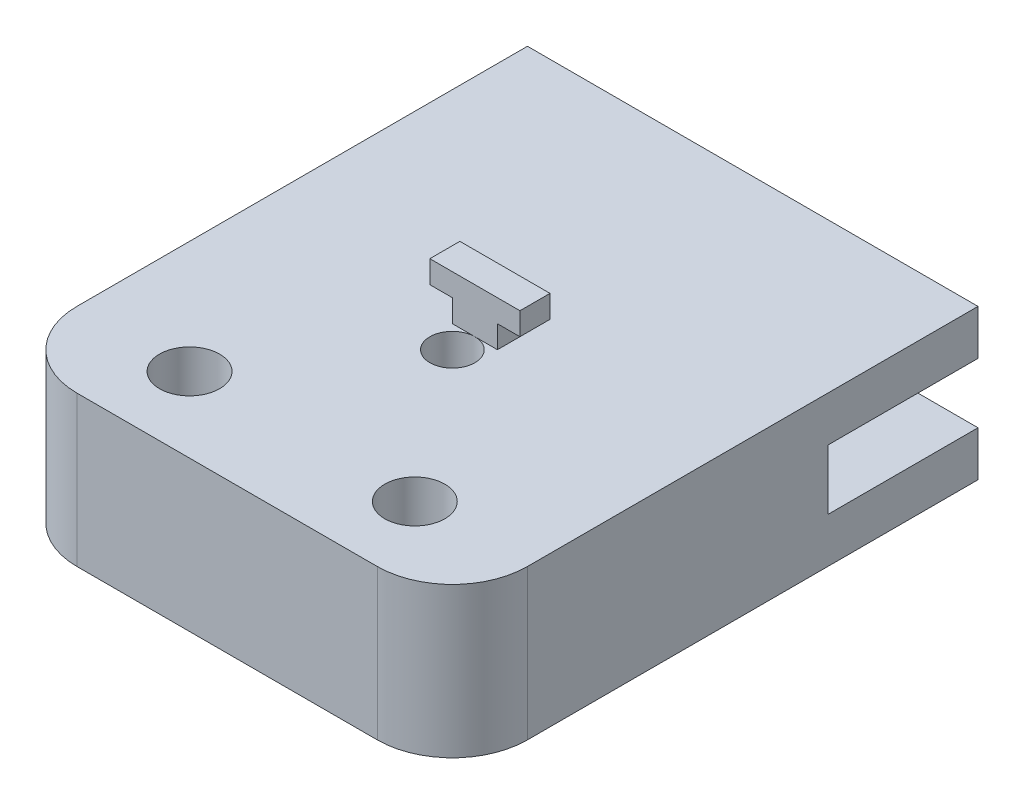
ISO-10303-21;
HEADER;
FILE_DESCRIPTION(('STEP AP214'),'2;1');
FILE_NAME('part.step','',(''),(''),'','','');
FILE_SCHEMA(('AUTOMOTIVE_DESIGN { 1 0 10303 214 1 1 1 1 }'));
ENDSEC;
DATA;
#1=APPLICATION_CONTEXT('core data for automotive mechanical design processes');
#2=APPLICATION_PROTOCOL_DEFINITION('international standard','automotive_design',2000,#1);
#3=PRODUCT_CONTEXT('',#1,'mechanical');
#4=PRODUCT('Part','Part','',(#3));
#5=PRODUCT_RELATED_PRODUCT_CATEGORY('part','',(#4));
#6=PRODUCT_DEFINITION_FORMATION('','',#4);
#7=PRODUCT_DEFINITION_CONTEXT('part definition',#1,'design');
#8=PRODUCT_DEFINITION('design','',#6,#7);
#9=PRODUCT_DEFINITION_SHAPE('','',#8);
#10=(LENGTH_UNIT() NAMED_UNIT(*) SI_UNIT(.MILLI.,.METRE.));
#11=(NAMED_UNIT(*) PLANE_ANGLE_UNIT() SI_UNIT($,.RADIAN.));
#12=(NAMED_UNIT(*) SI_UNIT($,.STERADIAN.) SOLID_ANGLE_UNIT());
#13=UNCERTAINTY_MEASURE_WITH_UNIT(LENGTH_MEASURE(1.E-05),#10,'distance_accuracy_value','');
#14=(GEOMETRIC_REPRESENTATION_CONTEXT(3) GLOBAL_UNCERTAINTY_ASSIGNED_CONTEXT((#13)) GLOBAL_UNIT_ASSIGNED_CONTEXT((#10,
#11,#12)) REPRESENTATION_CONTEXT('',''));
#15=CARTESIAN_POINT('',(0.,0.,0.));
#16=DIRECTION('',(0.,0.,1.));
#17=DIRECTION('',(1.,0.,0.));
#18=AXIS2_PLACEMENT_3D('',#15,#16,#17);
#19=CARTESIAN_POINT('',(0.,10.,0.));
#20=DIRECTION('',(0.,-1.,0.));
#21=DIRECTION('',(0.,0.,-1.));
#22=AXIS2_PLACEMENT_3D('',#19,#20,#21);
#23=PLANE('',#22);
#24=DIRECTION('',(-1.,0.,0.));
#25=VECTOR('',#24,1.);
#26=CARTESIAN_POINT('',(12.,10.,-18.5));
#27=LINE('',#26,#25);
#28=CARTESIAN_POINT('',(16.5,10.,-18.5));
#29=VERTEX_POINT('',#28);
#30=CARTESIAN_POINT('',(13.5,10.,-18.5));
#31=VERTEX_POINT('',#30);
#32=EDGE_CURVE('E307',#29,#31,#27,.T.);
#33=ORIENTED_EDGE('',*,*,#32,.F.);
#34=DIRECTION('',(0.,0.,1.));
#35=VECTOR('',#34,1.);
#36=CARTESIAN_POINT('',(16.5,10.,-19.5));
#37=LINE('',#36,#35);
#38=CARTESIAN_POINT('',(16.5,10.,-16.5));
#39=VERTEX_POINT('',#38);
#40=EDGE_CURVE('E308',#29,#39,#37,.T.);
#41=ORIENTED_EDGE('',*,*,#40,.T.);
#42=DIRECTION('',(1.,0.,0.));
#43=VECTOR('',#42,1.);
#44=CARTESIAN_POINT('',(12.,10.,-16.5));
#45=LINE('',#44,#43);
#46=CARTESIAN_POINT('',(15.,10.,-16.5));
#47=VERTEX_POINT('',#46);
#48=EDGE_CURVE('E284',#47,#39,#45,.T.);
#49=ORIENTED_EDGE('',*,*,#48,.F.);
#50=CARTESIAN_POINT('',(15.,10.,-15.));
#51=DIRECTION('',(0.,1.,0.));
#52=DIRECTION('',(0.,0.,1.));
#53=AXIS2_PLACEMENT_3D('',#50,#51,#52);
#54=CIRCLE('',#53,1.5);
#55=EDGE_CURVE('E187',#47,#47,#54,.T.);
#56=ORIENTED_EDGE('',*,*,#55,.F.);
#57=CARTESIAN_POINT('',(13.5,10.,-16.5));
#58=VERTEX_POINT('',#57);
#59=EDGE_CURVE('E305',#58,#47,#45,.T.);
#60=ORIENTED_EDGE('',*,*,#59,.F.);
#61=DIRECTION('',(0.,0.,1.));
#62=VECTOR('',#61,1.);
#63=CARTESIAN_POINT('',(13.5,10.,-19.5));
#64=LINE('',#63,#62);
#65=EDGE_CURVE('E56',#31,#58,#64,.T.);
#66=ORIENTED_EDGE('',*,*,#65,.F.);
#67=EDGE_LOOP('',(#33,#41,#49,#56,#60,#66));
#68=FACE_BOUND('',#67,.T.);
#69=CARTESIAN_POINT('',(22.5,10.,-5.));
#70=DIRECTION('',(0.,1.,0.));
#71=DIRECTION('',(0.,0.,1.));
#72=AXIS2_PLACEMENT_3D('',#69,#70,#71);
#73=CIRCLE('',#72,2.);
#74=CARTESIAN_POINT('',(22.5,10.,-3.));
#75=VERTEX_POINT('',#74);
#76=EDGE_CURVE('E220',#75,#75,#73,.T.);
#77=ORIENTED_EDGE('',*,*,#76,.F.);
#78=EDGE_LOOP('',(#77));
#79=FACE_BOUND('',#78,.T.);
#80=CARTESIAN_POINT('',(7.5,10.,-5.));
#81=DIRECTION('',(0.,1.,0.));
#82=DIRECTION('',(0.,0.,1.));
#83=AXIS2_PLACEMENT_3D('',#80,#81,#82);
#84=CIRCLE('',#83,2.);
#85=CARTESIAN_POINT('',(7.5,10.,-3.));
#86=VERTEX_POINT('',#85);
#87=EDGE_CURVE('E226',#86,#86,#84,.T.);
#88=ORIENTED_EDGE('',*,*,#87,.F.);
#89=EDGE_LOOP('',(#88));
#90=FACE_BOUND('',#89,.T.);
#91=DIRECTION('',(1.,0.,0.));
#92=VECTOR('',#91,1.);
#93=CARTESIAN_POINT('',(0.,10.,0.));
#94=LINE('',#93,#92);
#95=CARTESIAN_POINT('',(5.,10.,0.));
#96=VERTEX_POINT('',#95);
#97=CARTESIAN_POINT('',(25.,10.,0.));
#98=VERTEX_POINT('',#97);
#99=EDGE_CURVE('E235',#96,#98,#94,.T.);
#100=ORIENTED_EDGE('',*,*,#99,.T.);
#101=CARTESIAN_POINT('',(25.,10.,-5.));
#102=DIRECTION('',(0.,-1.,0.));
#103=DIRECTION('',(0.,0.,-1.));
#104=AXIS2_PLACEMENT_3D('',#101,#102,#103);
#105=CIRCLE('',#104,5.);
#106=CARTESIAN_POINT('',(30.,10.,-5.));
#107=VERTEX_POINT('',#106);
#108=EDGE_CURVE('E280',#98,#107,#105,.F.);
#109=ORIENTED_EDGE('',*,*,#108,.T.);
#110=DIRECTION('',(0.,0.,-1.));
#111=VECTOR('',#110,1.);
#112=CARTESIAN_POINT('',(30.,10.,0.));
#113=LINE('',#112,#111);
#114=CARTESIAN_POINT('',(30.,10.,-35.));
#115=VERTEX_POINT('',#114);
#116=EDGE_CURVE('E239',#107,#115,#113,.T.);
#117=ORIENTED_EDGE('',*,*,#116,.T.);
#118=DIRECTION('',(-1.,0.,0.));
#119=VECTOR('',#118,1.);
#120=CARTESIAN_POINT('',(0.,10.,-35.));
#121=LINE('',#120,#119);
#122=CARTESIAN_POINT('',(0.,10.,-35.));
#123=VERTEX_POINT('',#122);
#124=EDGE_CURVE('E241',#115,#123,#121,.T.);
#125=ORIENTED_EDGE('',*,*,#124,.T.);
#126=DIRECTION('',(0.,0.,1.));
#127=VECTOR('',#126,1.);
#128=CARTESIAN_POINT('',(0.,10.,0.));
#129=LINE('',#128,#127);
#130=CARTESIAN_POINT('',(0.,10.,-5.));
#131=VERTEX_POINT('',#130);
#132=EDGE_CURVE('E232',#123,#131,#129,.T.);
#133=ORIENTED_EDGE('',*,*,#132,.T.);
#134=CARTESIAN_POINT('',(5.,10.,-5.));
#135=DIRECTION('',(0.,-1.,0.));
#136=DIRECTION('',(0.,0.,-1.));
#137=AXIS2_PLACEMENT_3D('',#134,#135,#136);
#138=CIRCLE('',#137,5.);
#139=EDGE_CURVE('E278',#131,#96,#138,.F.);
#140=ORIENTED_EDGE('',*,*,#139,.T.);
#141=EDGE_LOOP('',(#100,#109,#117,#125,#133,#140));
#142=FACE_BOUND('',#141,.T.);
#143=ADVANCED_FACE('F33',(#68,#79,#90,#142),#23,.F.);
#144=CARTESIAN_POINT('',(0.,10.,-35.));
#145=DIRECTION('',(0.,0.,1.));
#146=DIRECTION('',(1.,0.,0.));
#147=AXIS2_PLACEMENT_3D('',#144,#145,#146);
#148=PLANE('',#147);
#149=DIRECTION('',(0.,-1.,0.));
#150=VECTOR('',#149,1.);
#151=CARTESIAN_POINT('',(0.,10.,-35.));
#152=LINE('',#151,#150);
#153=CARTESIAN_POINT('',(0.,3.,-35.));
#154=VERTEX_POINT('',#153);
#155=CARTESIAN_POINT('',(0.,0.,-35.));
#156=VERTEX_POINT('',#155);
#157=EDGE_CURVE('E243',#154,#156,#152,.T.);
#158=ORIENTED_EDGE('',*,*,#157,.F.);
#159=DIRECTION('',(1.,0.,0.));
#160=VECTOR('',#159,1.);
#161=CARTESIAN_POINT('',(0.,3.,-35.));
#162=LINE('',#161,#160);
#163=CARTESIAN_POINT('',(30.,3.,-35.));
#164=VERTEX_POINT('',#163);
#165=EDGE_CURVE('E263',#154,#164,#162,.T.);
#166=ORIENTED_EDGE('',*,*,#165,.T.);
#167=DIRECTION('',(0.,-1.,0.));
#168=VECTOR('',#167,1.);
#169=CARTESIAN_POINT('',(30.,10.,-35.));
#170=LINE('',#169,#168);
#171=CARTESIAN_POINT('',(30.,0.,-35.));
#172=VERTEX_POINT('',#171);
#173=EDGE_CURVE('E256',#164,#172,#170,.T.);
#174=ORIENTED_EDGE('',*,*,#173,.T.);
#175=DIRECTION('',(-1.,0.,0.));
#176=VECTOR('',#175,1.);
#177=CARTESIAN_POINT('',(0.,0.,-35.));
#178=LINE('',#177,#176);
#179=EDGE_CURVE('E236',#172,#156,#178,.T.);
#180=ORIENTED_EDGE('',*,*,#179,.T.);
#181=EDGE_LOOP('',(#158,#166,#174,#180));
#182=FACE_BOUND('',#181,.T.);
#183=ADVANCED_FACE('F348',(#182),#148,.F.);
#184=CARTESIAN_POINT('',(0.,0.,0.));
#185=DIRECTION('',(0.,-1.,0.));
#186=DIRECTION('',(0.,0.,-1.));
#187=AXIS2_PLACEMENT_3D('',#184,#185,#186);
#188=PLANE('',#187);
#189=CARTESIAN_POINT('',(15.,0.,-15.));
#190=DIRECTION('',(0.,1.,0.));
#191=DIRECTION('',(0.,0.,1.));
#192=AXIS2_PLACEMENT_3D('',#189,#190,#191);
#193=CIRCLE('',#192,1.5);
#194=CARTESIAN_POINT('',(15.,0.,-13.5));
#195=VERTEX_POINT('',#194);
#196=EDGE_CURVE('E193',#195,#195,#193,.T.);
#197=ORIENTED_EDGE('',*,*,#196,.T.);
#198=EDGE_LOOP('',(#197));
#199=FACE_BOUND('',#198,.T.);
#200=CARTESIAN_POINT('',(7.5,0.,-5.));
#201=DIRECTION('',(0.,1.,0.));
#202=DIRECTION('',(0.,0.,1.));
#203=AXIS2_PLACEMENT_3D('',#200,#201,#202);
#204=CIRCLE('',#203,2.);
#205=CARTESIAN_POINT('',(7.5,0.,-3.));
#206=VERTEX_POINT('',#205);
#207=EDGE_CURVE('E223',#206,#206,#204,.T.);
#208=ORIENTED_EDGE('',*,*,#207,.T.);
#209=EDGE_LOOP('',(#208));
#210=FACE_BOUND('',#209,.T.);
#211=DIRECTION('',(0.,0.,-1.));
#212=VECTOR('',#211,1.);
#213=CARTESIAN_POINT('',(30.,0.,0.));
#214=LINE('',#213,#212);
#215=CARTESIAN_POINT('',(30.,0.,-5.));
#216=VERTEX_POINT('',#215);
#217=EDGE_CURVE('E249',#216,#172,#214,.T.);
#218=ORIENTED_EDGE('',*,*,#217,.F.);
#219=CARTESIAN_POINT('',(25.,0.,-5.));
#220=DIRECTION('',(0.,-1.,0.));
#221=DIRECTION('',(0.,0.,-1.));
#222=AXIS2_PLACEMENT_3D('',#219,#220,#221);
#223=CIRCLE('',#222,5.);
#224=CARTESIAN_POINT('',(25.,0.,0.));
#225=VERTEX_POINT('',#224);
#226=EDGE_CURVE('E271',#216,#225,#223,.T.);
#227=ORIENTED_EDGE('',*,*,#226,.T.);
#228=DIRECTION('',(1.,0.,0.));
#229=VECTOR('',#228,1.);
#230=CARTESIAN_POINT('',(0.,0.,0.));
#231=LINE('',#230,#229);
#232=CARTESIAN_POINT('',(5.,0.,0.));
#233=VERTEX_POINT('',#232);
#234=EDGE_CURVE('E246',#233,#225,#231,.T.);
#235=ORIENTED_EDGE('',*,*,#234,.F.);
#236=CARTESIAN_POINT('',(5.,0.,-5.));
#237=DIRECTION('',(0.,-1.,0.));
#238=DIRECTION('',(0.,0.,-1.));
#239=AXIS2_PLACEMENT_3D('',#236,#237,#238);
#240=CIRCLE('',#239,5.);
#241=CARTESIAN_POINT('',(0.,0.,-5.));
#242=VERTEX_POINT('',#241);
#243=EDGE_CURVE('E269',#233,#242,#240,.T.);
#244=ORIENTED_EDGE('',*,*,#243,.T.);
#245=DIRECTION('',(0.,0.,1.));
#246=VECTOR('',#245,1.);
#247=CARTESIAN_POINT('',(0.,0.,0.));
#248=LINE('',#247,#246);
#249=EDGE_CURVE('E229',#156,#242,#248,.T.);
#250=ORIENTED_EDGE('',*,*,#249,.F.);
#251=ORIENTED_EDGE('',*,*,#179,.F.);
#252=EDGE_LOOP('',(#218,#227,#235,#244,#250,#251));
#253=FACE_BOUND('',#252,.T.);
#254=CARTESIAN_POINT('',(22.5,0.,-5.));
#255=DIRECTION('',(0.,1.,0.));
#256=DIRECTION('',(0.,0.,1.));
#257=AXIS2_PLACEMENT_3D('',#254,#255,#256);
#258=CIRCLE('',#257,2.);
#259=CARTESIAN_POINT('',(22.5,0.,-3.));
#260=VERTEX_POINT('',#259);
#261=EDGE_CURVE('E219',#260,#260,#258,.T.);
#262=ORIENTED_EDGE('',*,*,#261,.T.);
#263=EDGE_LOOP('',(#262));
#264=FACE_BOUND('',#263,.T.);
#265=ADVANCED_FACE('F353',(#199,#210,#253,#264),#188,.T.);
#266=CARTESIAN_POINT('',(0.,10.,0.));
#267=DIRECTION('',(1.,0.,0.));
#268=DIRECTION('',(0.,0.,-1.));
#269=AXIS2_PLACEMENT_3D('',#266,#267,#268);
#270=PLANE('',#269);
#271=ORIENTED_EDGE('',*,*,#249,.T.);
#272=DIRECTION('',(0.,-1.,0.));
#273=VECTOR('',#272,1.);
#274=CARTESIAN_POINT('',(0.,10.,-5.));
#275=LINE('',#274,#273);
#276=EDGE_CURVE('E282',#242,#131,#275,.F.);
#277=ORIENTED_EDGE('',*,*,#276,.T.);
#278=ORIENTED_EDGE('',*,*,#132,.F.);
#279=CARTESIAN_POINT('',(0.,7.,-35.));
#280=VERTEX_POINT('',#279);
#281=EDGE_CURVE('E253',#123,#280,#152,.T.);
#282=ORIENTED_EDGE('',*,*,#281,.T.);
#283=DIRECTION('',(0.,0.,1.));
#284=VECTOR('',#283,1.);
#285=CARTESIAN_POINT('',(0.,7.,0.));
#286=LINE('',#285,#284);
#287=CARTESIAN_POINT('',(0.,7.,-25.));
#288=VERTEX_POINT('',#287);
#289=EDGE_CURVE('E209',#280,#288,#286,.T.);
#290=ORIENTED_EDGE('',*,*,#289,.T.);
#291=DIRECTION('',(0.,-1.,0.));
#292=VECTOR('',#291,1.);
#293=CARTESIAN_POINT('',(0.,10.,-25.));
#294=LINE('',#293,#292);
#295=CARTESIAN_POINT('',(0.,3.,-25.));
#296=VERTEX_POINT('',#295);
#297=EDGE_CURVE('E216',#288,#296,#294,.T.);
#298=ORIENTED_EDGE('',*,*,#297,.T.);
#299=DIRECTION('',(0.,0.,-1.));
#300=VECTOR('',#299,1.);
#301=CARTESIAN_POINT('',(0.,3.,0.));
#302=LINE('',#301,#300);
#303=EDGE_CURVE('E213',#296,#154,#302,.T.);
#304=ORIENTED_EDGE('',*,*,#303,.T.);
#305=ORIENTED_EDGE('',*,*,#157,.T.);
#306=EDGE_LOOP('',(#271,#277,#278,#282,#290,#298,#304,#305));
#307=FACE_BOUND('',#306,.T.);
#308=ADVANCED_FACE('F362',(#307),#270,.F.);
#309=CARTESIAN_POINT('',(0.,10.,0.));
#310=DIRECTION('',(0.,0.,-1.));
#311=DIRECTION('',(-1.,0.,0.));
#312=AXIS2_PLACEMENT_3D('',#309,#310,#311);
#313=PLANE('',#312);
#314=ORIENTED_EDGE('',*,*,#234,.T.);
#315=DIRECTION('',(0.,-1.,0.));
#316=VECTOR('',#315,1.);
#317=CARTESIAN_POINT('',(25.,10.,0.));
#318=LINE('',#317,#316);
#319=EDGE_CURVE('E276',#225,#98,#318,.F.);
#320=ORIENTED_EDGE('',*,*,#319,.T.);
#321=ORIENTED_EDGE('',*,*,#99,.F.);
#322=DIRECTION('',(0.,-1.,0.));
#323=VECTOR('',#322,1.);
#324=CARTESIAN_POINT('',(5.,10.,0.));
#325=LINE('',#324,#323);
#326=EDGE_CURVE('E273',#96,#233,#325,.T.);
#327=ORIENTED_EDGE('',*,*,#326,.T.);
#328=EDGE_LOOP('',(#314,#320,#321,#327));
#329=FACE_BOUND('',#328,.T.);
#330=ADVANCED_FACE('F370',(#329),#313,.F.);
#331=CARTESIAN_POINT('',(30.,10.,0.));
#332=DIRECTION('',(-1.,0.,0.));
#333=DIRECTION('',(0.,0.,1.));
#334=AXIS2_PLACEMENT_3D('',#331,#332,#333);
#335=PLANE('',#334);
#336=ORIENTED_EDGE('',*,*,#116,.F.);
#337=DIRECTION('',(0.,-1.,0.));
#338=VECTOR('',#337,1.);
#339=CARTESIAN_POINT('',(30.,10.,-5.));
#340=LINE('',#339,#338);
#341=EDGE_CURVE('E266',#107,#216,#340,.T.);
#342=ORIENTED_EDGE('',*,*,#341,.T.);
#343=ORIENTED_EDGE('',*,*,#217,.T.);
#344=ORIENTED_EDGE('',*,*,#173,.F.);
#345=DIRECTION('',(0.,0.,-1.));
#346=VECTOR('',#345,1.);
#347=CARTESIAN_POINT('',(30.,3.,-35.));
#348=LINE('',#347,#346);
#349=CARTESIAN_POINT('',(30.,3.,-25.));
#350=VERTEX_POINT('',#349);
#351=EDGE_CURVE('E204',#350,#164,#348,.T.);
#352=ORIENTED_EDGE('',*,*,#351,.F.);
#353=DIRECTION('',(0.,-1.,0.));
#354=VECTOR('',#353,1.);
#355=CARTESIAN_POINT('',(30.,3.,-25.));
#356=LINE('',#355,#354);
#357=CARTESIAN_POINT('',(30.,7.,-25.));
#358=VERTEX_POINT('',#357);
#359=EDGE_CURVE('E201',#358,#350,#356,.T.);
#360=ORIENTED_EDGE('',*,*,#359,.F.);
#361=DIRECTION('',(0.,0.,1.));
#362=VECTOR('',#361,1.);
#363=CARTESIAN_POINT('',(30.,7.,-35.));
#364=LINE('',#363,#362);
#365=CARTESIAN_POINT('',(30.,7.,-35.));
#366=VERTEX_POINT('',#365);
#367=EDGE_CURVE('E196',#366,#358,#364,.T.);
#368=ORIENTED_EDGE('',*,*,#367,.F.);
#369=EDGE_CURVE('E257',#115,#366,#170,.T.);
#370=ORIENTED_EDGE('',*,*,#369,.F.);
#371=EDGE_LOOP('',(#336,#342,#343,#344,#352,#360,#368,#370));
#372=FACE_BOUND('',#371,.T.);
#373=ADVANCED_FACE('F366',(#372),#335,.F.);
#374=ORIENTED_EDGE('',*,*,#369,.T.);
#375=DIRECTION('',(-1.,0.,0.));
#376=VECTOR('',#375,1.);
#377=CARTESIAN_POINT('',(0.,7.,-35.));
#378=LINE('',#377,#376);
#379=EDGE_CURVE('E260',#366,#280,#378,.T.);
#380=ORIENTED_EDGE('',*,*,#379,.T.);
#381=ORIENTED_EDGE('',*,*,#281,.F.);
#382=ORIENTED_EDGE('',*,*,#124,.F.);
#383=EDGE_LOOP('',(#374,#380,#381,#382));
#384=FACE_BOUND('',#383,.T.);
#385=ADVANCED_FACE('F356',(#384),#148,.F.);
#386=CARTESIAN_POINT('',(7.5,10.,-5.));
#387=DIRECTION('',(0.,-1.,0.));
#388=DIRECTION('',(0.,0.,-1.));
#389=AXIS2_PLACEMENT_3D('',#386,#387,#388);
#390=CYLINDRICAL_SURFACE('',#389,2.);
#391=ORIENTED_EDGE('',*,*,#87,.T.);
#392=EDGE_LOOP('',(#391));
#393=FACE_BOUND('',#392,.T.);
#394=ORIENTED_EDGE('',*,*,#207,.F.);
#395=EDGE_LOOP('',(#394));
#396=FACE_BOUND('',#395,.T.);
#397=ADVANCED_FACE('F359',(#393,#396),#390,.F.);
#398=CARTESIAN_POINT('',(22.5,10.,-5.));
#399=DIRECTION('',(0.,-1.,0.));
#400=DIRECTION('',(0.,0.,-1.));
#401=AXIS2_PLACEMENT_3D('',#398,#399,#400);
#402=CYLINDRICAL_SURFACE('',#401,2.);
#403=ORIENTED_EDGE('',*,*,#76,.T.);
#404=EDGE_LOOP('',(#403));
#405=FACE_BOUND('',#404,.T.);
#406=ORIENTED_EDGE('',*,*,#261,.F.);
#407=EDGE_LOOP('',(#406));
#408=FACE_BOUND('',#407,.T.);
#409=ADVANCED_FACE('F417',(#405,#408),#402,.F.);
#410=CARTESIAN_POINT('',(-11.,3.,-25.));
#411=DIRECTION('',(0.,0.,1.));
#412=DIRECTION('',(1.,0.,0.));
#413=AXIS2_PLACEMENT_3D('',#410,#411,#412);
#414=PLANE('',#413);
#415=DIRECTION('',(1.,0.,0.));
#416=VECTOR('',#415,1.);
#417=CARTESIAN_POINT('',(-11.,7.,-25.));
#418=LINE('',#417,#416);
#419=EDGE_CURVE('E206',#288,#358,#418,.T.);
#420=ORIENTED_EDGE('',*,*,#419,.T.);
#421=ORIENTED_EDGE('',*,*,#359,.T.);
#422=DIRECTION('',(1.,0.,0.));
#423=VECTOR('',#422,1.);
#424=CARTESIAN_POINT('',(-11.,3.,-25.));
#425=LINE('',#424,#423);
#426=EDGE_CURVE('E207',#296,#350,#425,.T.);
#427=ORIENTED_EDGE('',*,*,#426,.F.);
#428=ORIENTED_EDGE('',*,*,#297,.F.);
#429=EDGE_LOOP('',(#420,#421,#427,#428));
#430=FACE_BOUND('',#429,.T.);
#431=ADVANCED_FACE('F415',(#430),#414,.F.);
#432=CARTESIAN_POINT('',(-11.,3.,-35.));
#433=DIRECTION('',(0.,-1.,0.));
#434=DIRECTION('',(0.,0.,-1.));
#435=AXIS2_PLACEMENT_3D('',#432,#433,#434);
#436=PLANE('',#435);
#437=ORIENTED_EDGE('',*,*,#426,.T.);
#438=ORIENTED_EDGE('',*,*,#351,.T.);
#439=ORIENTED_EDGE('',*,*,#165,.F.);
#440=ORIENTED_EDGE('',*,*,#303,.F.);
#441=EDGE_LOOP('',(#437,#438,#439,#440));
#442=FACE_BOUND('',#441,.T.);
#443=ADVANCED_FACE('F383',(#442),#436,.F.);
#444=CARTESIAN_POINT('',(-11.,7.,-35.));
#445=DIRECTION('',(0.,1.,0.));
#446=DIRECTION('',(0.,0.,1.));
#447=AXIS2_PLACEMENT_3D('',#444,#445,#446);
#448=PLANE('',#447);
#449=ORIENTED_EDGE('',*,*,#379,.F.);
#450=ORIENTED_EDGE('',*,*,#367,.T.);
#451=ORIENTED_EDGE('',*,*,#419,.F.);
#452=ORIENTED_EDGE('',*,*,#289,.F.);
#453=EDGE_LOOP('',(#449,#450,#451,#452));
#454=FACE_BOUND('',#453,.T.);
#455=ADVANCED_FACE('F378',(#454),#448,.F.);
#456=CARTESIAN_POINT('',(25.,10.,-5.));
#457=DIRECTION('',(0.,-1.,0.));
#458=DIRECTION('',(0.,0.,-1.));
#459=AXIS2_PLACEMENT_3D('',#456,#457,#458);
#460=CYLINDRICAL_SURFACE('',#459,5.);
#461=ORIENTED_EDGE('',*,*,#108,.F.);
#462=ORIENTED_EDGE('',*,*,#319,.F.);
#463=ORIENTED_EDGE('',*,*,#226,.F.);
#464=ORIENTED_EDGE('',*,*,#341,.F.);
#465=EDGE_LOOP('',(#461,#462,#463,#464));
#466=FACE_BOUND('',#465,.T.);
#467=ADVANCED_FACE('F344',(#466),#460,.T.);
#468=CARTESIAN_POINT('',(5.,10.,-5.));
#469=DIRECTION('',(0.,-1.,0.));
#470=DIRECTION('',(0.,0.,-1.));
#471=AXIS2_PLACEMENT_3D('',#468,#469,#470);
#472=CYLINDRICAL_SURFACE('',#471,5.);
#473=ORIENTED_EDGE('',*,*,#139,.F.);
#474=ORIENTED_EDGE('',*,*,#276,.F.);
#475=ORIENTED_EDGE('',*,*,#243,.F.);
#476=ORIENTED_EDGE('',*,*,#326,.F.);
#477=EDGE_LOOP('',(#473,#474,#475,#476));
#478=FACE_BOUND('',#477,.T.);
#479=ADVANCED_FACE('F35',(#478),#472,.T.);
#480=CARTESIAN_POINT('',(15.,0.,-15.));
#481=DIRECTION('',(0.,1.,0.));
#482=DIRECTION('',(0.,0.,1.));
#483=AXIS2_PLACEMENT_3D('',#480,#481,#482);
#484=CYLINDRICAL_SURFACE('',#483,1.5);
#485=ORIENTED_EDGE('',*,*,#196,.F.);
#486=EDGE_LOOP('',(#485));
#487=FACE_BOUND('',#486,.T.);
#488=ORIENTED_EDGE('',*,*,#55,.T.);
#489=EDGE_LOOP('',(#488));
#490=FACE_BOUND('',#489,.T.);
#491=ADVANCED_FACE('F332',(#487,#490),#484,.F.);
#492=CARTESIAN_POINT('',(12.,13.,-16.5));
#493=DIRECTION('',(1.,0.,0.));
#494=DIRECTION('',(0.,0.,-1.));
#495=AXIS2_PLACEMENT_3D('',#492,#493,#494);
#496=PLANE('',#495);
#497=DIRECTION('',(0.,-1.,0.));
#498=VECTOR('',#497,1.);
#499=CARTESIAN_POINT('',(12.,13.,-18.5));
#500=LINE('',#499,#498);
#501=CARTESIAN_POINT('',(12.,13.,-18.5));
#502=VERTEX_POINT('',#501);
#503=CARTESIAN_POINT('',(12.,11.5,-18.5));
#504=VERTEX_POINT('',#503);
#505=EDGE_CURVE('E189',#502,#504,#500,.T.);
#506=ORIENTED_EDGE('',*,*,#505,.T.);
#507=DIRECTION('',(0.,0.,1.));
#508=VECTOR('',#507,1.);
#509=CARTESIAN_POINT('',(12.,11.5,-19.5));
#510=LINE('',#509,#508);
#511=CARTESIAN_POINT('',(12.,11.5,-16.5));
#512=VERTEX_POINT('',#511);
#513=EDGE_CURVE('E179',#504,#512,#510,.T.);
#514=ORIENTED_EDGE('',*,*,#513,.T.);
#515=DIRECTION('',(0.,-1.,0.));
#516=VECTOR('',#515,1.);
#517=CARTESIAN_POINT('',(12.,13.,-16.5));
#518=LINE('',#517,#516);
#519=CARTESIAN_POINT('',(12.,13.,-16.5));
#520=VERTEX_POINT('',#519);
#521=EDGE_CURVE('E183',#520,#512,#518,.T.);
#522=ORIENTED_EDGE('',*,*,#521,.F.);
#523=DIRECTION('',(0.,0.,1.));
#524=VECTOR('',#523,1.);
#525=CARTESIAN_POINT('',(12.,13.,-16.5));
#526=LINE('',#525,#524);
#527=EDGE_CURVE('E309',#502,#520,#526,.T.);
#528=ORIENTED_EDGE('',*,*,#527,.F.);
#529=EDGE_LOOP('',(#506,#514,#522,#528));
#530=FACE_BOUND('',#529,.T.);
#531=ADVANCED_FACE('F334',(#530),#496,.F.);
#532=CARTESIAN_POINT('',(12.,13.,-16.5));
#533=DIRECTION('',(0.,0.,-1.));
#534=DIRECTION('',(-1.,0.,0.));
#535=AXIS2_PLACEMENT_3D('',#532,#533,#534);
#536=PLANE('',#535);
#537=ORIENTED_EDGE('',*,*,#48,.T.);
#538=DIRECTION('',(0.,-1.,0.));
#539=VECTOR('',#538,1.);
#540=CARTESIAN_POINT('',(16.5,10.,-16.5));
#541=LINE('',#540,#539);
#542=CARTESIAN_POINT('',(16.5,11.5,-16.5));
#543=VERTEX_POINT('',#542);
#544=EDGE_CURVE('E170',#543,#39,#541,.T.);
#545=ORIENTED_EDGE('',*,*,#544,.F.);
#546=DIRECTION('',(-1.,0.,0.));
#547=VECTOR('',#546,1.);
#548=CARTESIAN_POINT('',(18.,11.5,-16.5));
#549=LINE('',#548,#547);
#550=CARTESIAN_POINT('',(18.,11.5,-16.5));
#551=VERTEX_POINT('',#550);
#552=EDGE_CURVE('E163',#551,#543,#549,.T.);
#553=ORIENTED_EDGE('',*,*,#552,.F.);
#554=DIRECTION('',(0.,-1.,0.));
#555=VECTOR('',#554,1.);
#556=CARTESIAN_POINT('',(18.,13.,-16.5));
#557=LINE('',#556,#555);
#558=CARTESIAN_POINT('',(18.,13.,-16.5));
#559=VERTEX_POINT('',#558);
#560=EDGE_CURVE('E176',#559,#551,#557,.T.);
#561=ORIENTED_EDGE('',*,*,#560,.F.);
#562=DIRECTION('',(1.,0.,0.));
#563=VECTOR('',#562,1.);
#564=CARTESIAN_POINT('',(12.,13.,-16.5));
#565=LINE('',#564,#563);
#566=EDGE_CURVE('E301',#520,#559,#565,.T.);
#567=ORIENTED_EDGE('',*,*,#566,.F.);
#568=ORIENTED_EDGE('',*,*,#521,.T.);
#569=DIRECTION('',(-1.,0.,0.));
#570=VECTOR('',#569,1.);
#571=CARTESIAN_POINT('',(12.,11.5,-16.5));
#572=LINE('',#571,#570);
#573=CARTESIAN_POINT('',(13.5,11.5,-16.5));
#574=VERTEX_POINT('',#573);
#575=EDGE_CURVE('E315',#574,#512,#572,.T.);
#576=ORIENTED_EDGE('',*,*,#575,.F.);
#577=DIRECTION('',(0.,1.,0.));
#578=VECTOR('',#577,1.);
#579=CARTESIAN_POINT('',(13.5,10.,-16.5));
#580=LINE('',#579,#578);
#581=EDGE_CURVE('E320',#58,#574,#580,.T.);
#582=ORIENTED_EDGE('',*,*,#581,.F.);
#583=ORIENTED_EDGE('',*,*,#59,.T.);
#584=EDGE_LOOP('',(#537,#545,#553,#561,#567,#568,#576,#582,#583));
#585=FACE_BOUND('',#584,.T.);
#586=ADVANCED_FACE('F175',(#585),#536,.F.);
#587=CARTESIAN_POINT('',(18.,13.,-16.5));
#588=DIRECTION('',(-1.,0.,0.));
#589=DIRECTION('',(0.,0.,1.));
#590=AXIS2_PLACEMENT_3D('',#587,#588,#589);
#591=PLANE('',#590);
#592=ORIENTED_EDGE('',*,*,#560,.T.);
#593=DIRECTION('',(0.,0.,1.));
#594=VECTOR('',#593,1.);
#595=CARTESIAN_POINT('',(18.,11.5,-19.5));
#596=LINE('',#595,#594);
#597=CARTESIAN_POINT('',(18.,11.5,-18.5));
#598=VERTEX_POINT('',#597);
#599=EDGE_CURVE('E160',#598,#551,#596,.T.);
#600=ORIENTED_EDGE('',*,*,#599,.F.);
#601=DIRECTION('',(0.,-1.,0.));
#602=VECTOR('',#601,1.);
#603=CARTESIAN_POINT('',(18.,13.,-18.5));
#604=LINE('',#603,#602);
#605=CARTESIAN_POINT('',(18.,13.,-18.5));
#606=VERTEX_POINT('',#605);
#607=EDGE_CURVE('E184',#606,#598,#604,.T.);
#608=ORIENTED_EDGE('',*,*,#607,.F.);
#609=DIRECTION('',(0.,0.,-1.));
#610=VECTOR('',#609,1.);
#611=CARTESIAN_POINT('',(18.,13.,-16.5));
#612=LINE('',#611,#610);
#613=EDGE_CURVE('E182',#559,#606,#612,.T.);
#614=ORIENTED_EDGE('',*,*,#613,.F.);
#615=EDGE_LOOP('',(#592,#600,#608,#614));
#616=FACE_BOUND('',#615,.T.);
#617=ADVANCED_FACE('F181',(#616),#591,.F.);
#618=CARTESIAN_POINT('',(12.,13.,-18.5));
#619=DIRECTION('',(0.,0.,1.));
#620=DIRECTION('',(1.,0.,0.));
#621=AXIS2_PLACEMENT_3D('',#618,#619,#620);
#622=PLANE('',#621);
#623=DIRECTION('',(-1.,0.,0.));
#624=VECTOR('',#623,1.);
#625=CARTESIAN_POINT('',(12.,11.5,-18.5));
#626=LINE('',#625,#624);
#627=CARTESIAN_POINT('',(16.5,11.5,-18.5));
#628=VERTEX_POINT('',#627);
#629=EDGE_CURVE('E41',#598,#628,#626,.T.);
#630=ORIENTED_EDGE('',*,*,#629,.T.);
#631=DIRECTION('',(0.,-1.,0.));
#632=VECTOR('',#631,1.);
#633=CARTESIAN_POINT('',(16.5,13.,-18.5));
#634=LINE('',#633,#632);
#635=EDGE_CURVE('E11',#628,#29,#634,.T.);
#636=ORIENTED_EDGE('',*,*,#635,.T.);
#637=ORIENTED_EDGE('',*,*,#32,.T.);
#638=DIRECTION('',(0.,1.,0.));
#639=VECTOR('',#638,1.);
#640=CARTESIAN_POINT('',(13.5,13.,-18.5));
#641=LINE('',#640,#639);
#642=CARTESIAN_POINT('',(13.5,11.5,-18.5));
#643=VERTEX_POINT('',#642);
#644=EDGE_CURVE('E285',#31,#643,#641,.T.);
#645=ORIENTED_EDGE('',*,*,#644,.T.);
#646=DIRECTION('',(-1.,0.,0.));
#647=VECTOR('',#646,1.);
#648=CARTESIAN_POINT('',(12.,11.5,-18.5));
#649=LINE('',#648,#647);
#650=EDGE_CURVE('E288',#643,#504,#649,.T.);
#651=ORIENTED_EDGE('',*,*,#650,.T.);
#652=ORIENTED_EDGE('',*,*,#505,.F.);
#653=DIRECTION('',(-1.,0.,0.));
#654=VECTOR('',#653,1.);
#655=CARTESIAN_POINT('',(12.,13.,-18.5));
#656=LINE('',#655,#654);
#657=EDGE_CURVE('E295',#606,#502,#656,.T.);
#658=ORIENTED_EDGE('',*,*,#657,.F.);
#659=ORIENTED_EDGE('',*,*,#607,.T.);
#660=EDGE_LOOP('',(#630,#636,#637,#645,#651,#652,#658,#659));
#661=FACE_BOUND('',#660,.T.);
#662=ADVANCED_FACE('F291',(#661),#622,.F.);
#663=CARTESIAN_POINT('',(0.,13.,0.));
#664=DIRECTION('',(0.,-1.,0.));
#665=DIRECTION('',(0.,0.,-1.));
#666=AXIS2_PLACEMENT_3D('',#663,#664,#665);
#667=PLANE('',#666);
#668=ORIENTED_EDGE('',*,*,#527,.T.);
#669=ORIENTED_EDGE('',*,*,#566,.T.);
#670=ORIENTED_EDGE('',*,*,#613,.T.);
#671=ORIENTED_EDGE('',*,*,#657,.T.);
#672=EDGE_LOOP('',(#668,#669,#670,#671));
#673=FACE_BOUND('',#672,.T.);
#674=ADVANCED_FACE('F542',(#673),#667,.F.);
#675=CARTESIAN_POINT('',(12.,11.5,-19.5));
#676=DIRECTION('',(0.,1.,0.));
#677=DIRECTION('',(0.,0.,1.));
#678=AXIS2_PLACEMENT_3D('',#675,#676,#677);
#679=PLANE('',#678);
#680=DIRECTION('',(0.,0.,1.));
#681=VECTOR('',#680,1.);
#682=CARTESIAN_POINT('',(13.5,11.5,-19.5));
#683=LINE('',#682,#681);
#684=EDGE_CURVE('E314',#643,#574,#683,.T.);
#685=ORIENTED_EDGE('',*,*,#684,.T.);
#686=ORIENTED_EDGE('',*,*,#575,.T.);
#687=ORIENTED_EDGE('',*,*,#513,.F.);
#688=ORIENTED_EDGE('',*,*,#650,.F.);
#689=EDGE_LOOP('',(#685,#686,#687,#688));
#690=FACE_BOUND('',#689,.T.);
#691=ADVANCED_FACE('F549',(#690),#679,.F.);
#692=CARTESIAN_POINT('',(13.5,10.,-19.5));
#693=DIRECTION('',(1.,0.,0.));
#694=DIRECTION('',(0.,0.,-1.));
#695=AXIS2_PLACEMENT_3D('',#692,#693,#694);
#696=PLANE('',#695);
#697=ORIENTED_EDGE('',*,*,#65,.T.);
#698=ORIENTED_EDGE('',*,*,#581,.T.);
#699=ORIENTED_EDGE('',*,*,#684,.F.);
#700=ORIENTED_EDGE('',*,*,#644,.F.);
#701=EDGE_LOOP('',(#697,#698,#699,#700));
#702=FACE_BOUND('',#701,.T.);
#703=ADVANCED_FACE('F561',(#702),#696,.F.);
#704=CARTESIAN_POINT('',(16.5,10.,-19.5));
#705=DIRECTION('',(-1.,0.,0.));
#706=DIRECTION('',(0.,0.,1.));
#707=AXIS2_PLACEMENT_3D('',#704,#705,#706);
#708=PLANE('',#707);
#709=DIRECTION('',(0.,0.,1.));
#710=VECTOR('',#709,1.);
#711=CARTESIAN_POINT('',(16.5,11.5,-19.5));
#712=LINE('',#711,#710);
#713=EDGE_CURVE('E48',#628,#543,#712,.T.);
#714=ORIENTED_EDGE('',*,*,#713,.T.);
#715=ORIENTED_EDGE('',*,*,#544,.T.);
#716=ORIENTED_EDGE('',*,*,#40,.F.);
#717=ORIENTED_EDGE('',*,*,#635,.F.);
#718=EDGE_LOOP('',(#714,#715,#716,#717));
#719=FACE_BOUND('',#718,.T.);
#720=ADVANCED_FACE('F326',(#719),#708,.F.);
#721=CARTESIAN_POINT('',(18.,11.5,-19.5));
#722=DIRECTION('',(0.,1.,0.));
#723=DIRECTION('',(0.,0.,1.));
#724=AXIS2_PLACEMENT_3D('',#721,#722,#723);
#725=PLANE('',#724);
#726=ORIENTED_EDGE('',*,*,#599,.T.);
#727=ORIENTED_EDGE('',*,*,#552,.T.);
#728=ORIENTED_EDGE('',*,*,#713,.F.);
#729=ORIENTED_EDGE('',*,*,#629,.F.);
#730=EDGE_LOOP('',(#726,#727,#728,#729));
#731=FACE_BOUND('',#730,.T.);
#732=ADVANCED_FACE('F162',(#731),#725,.F.);
#733=CLOSED_SHELL('',(#143,#183,#265,#308,#330,#373,#385,#397,#409,#431,#443,#455,#467,#479,
#491,#531,#586,#617,#662,#674,#691,#703,#720,#732));
#734=MANIFOLD_SOLID_BREP('B2',#733);
#735=ADVANCED_BREP_SHAPE_REPRESENTATION('',(#18,#734),#14);
#736=SHAPE_DEFINITION_REPRESENTATION(#9,#735);
ENDSEC;
END-ISO-10303-21;
